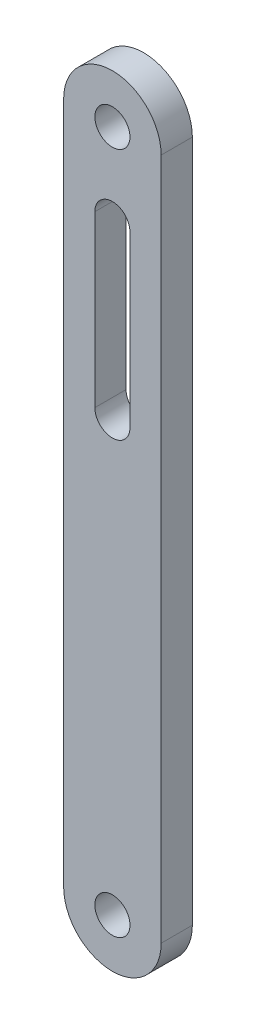
ISO-10303-21;
HEADER;
FILE_DESCRIPTION(('STEP AP214'),'2;1');
FILE_NAME('part.step','',(''),(''),'','','');
FILE_SCHEMA(('AUTOMOTIVE_DESIGN { 1 0 10303 214 1 1 1 1 }'));
ENDSEC;
DATA;
#1=APPLICATION_CONTEXT('core data for automotive mechanical design processes');
#2=APPLICATION_PROTOCOL_DEFINITION('international standard','automotive_design',2000,#1);
#3=PRODUCT_CONTEXT('',#1,'mechanical');
#4=PRODUCT('Part','Part','',(#3));
#5=PRODUCT_RELATED_PRODUCT_CATEGORY('part','',(#4));
#6=PRODUCT_DEFINITION_FORMATION('','',#4);
#7=PRODUCT_DEFINITION_CONTEXT('part definition',#1,'design');
#8=PRODUCT_DEFINITION('design','',#6,#7);
#9=PRODUCT_DEFINITION_SHAPE('','',#8);
#10=(LENGTH_UNIT() NAMED_UNIT(*) SI_UNIT(.MILLI.,.METRE.));
#11=(NAMED_UNIT(*) PLANE_ANGLE_UNIT() SI_UNIT($,.RADIAN.));
#12=(NAMED_UNIT(*) SI_UNIT($,.STERADIAN.) SOLID_ANGLE_UNIT());
#13=UNCERTAINTY_MEASURE_WITH_UNIT(LENGTH_MEASURE(1.E-05),#10,'distance_accuracy_value','');
#14=(GEOMETRIC_REPRESENTATION_CONTEXT(3) GLOBAL_UNCERTAINTY_ASSIGNED_CONTEXT((#13)) GLOBAL_UNIT_ASSIGNED_CONTEXT((#10,
#11,#12)) REPRESENTATION_CONTEXT('',''));
#15=CARTESIAN_POINT('',(0.,0.,0.));
#16=DIRECTION('',(0.,0.,1.));
#17=DIRECTION('',(1.,0.,0.));
#18=AXIS2_PLACEMENT_3D('',#15,#16,#17);
#19=CARTESIAN_POINT('',(0.,-35.,3.2));
#20=DIRECTION('',(0.,0.,1.));
#21=DIRECTION('',(1.,0.,0.));
#22=AXIS2_PLACEMENT_3D('',#19,#20,#21);
#23=PLANE('',#22);
#24=CARTESIAN_POINT('',(0.,35.,3.2));
#25=DIRECTION('',(0.,0.,1.));
#26=DIRECTION('',(1.,0.,0.));
#27=AXIS2_PLACEMENT_3D('',#24,#25,#26);
#28=CIRCLE('',#27,1.8);
#29=CARTESIAN_POINT('',(1.8,35.,3.2));
#30=VERTEX_POINT('',#29);
#31=EDGE_CURVE('E161',#30,#30,#28,.T.);
#32=ORIENTED_EDGE('',*,*,#31,.F.);
#33=EDGE_LOOP('',(#32));
#34=FACE_BOUND('',#33,.T.);
#35=CARTESIAN_POINT('',(0.,-35.,3.2));
#36=DIRECTION('',(0.,0.,1.));
#37=DIRECTION('',(1.,0.,0.));
#38=AXIS2_PLACEMENT_3D('',#35,#36,#37);
#39=CIRCLE('',#38,5.);
#40=CARTESIAN_POINT('',(-5.,-35.,3.2));
#41=VERTEX_POINT('',#40);
#42=CARTESIAN_POINT('',(5.,-35.,3.2));
#43=VERTEX_POINT('',#42);
#44=EDGE_CURVE('E169',#41,#43,#39,.T.);
#45=ORIENTED_EDGE('',*,*,#44,.T.);
#46=DIRECTION('',(0.,1.,0.));
#47=VECTOR('',#46,1.);
#48=CARTESIAN_POINT('',(5.,-35.,3.2));
#49=LINE('',#48,#47);
#50=CARTESIAN_POINT('',(5.,35.,3.2));
#51=VERTEX_POINT('',#50);
#52=EDGE_CURVE('E173',#43,#51,#49,.T.);
#53=ORIENTED_EDGE('',*,*,#52,.T.);
#54=CARTESIAN_POINT('',(0.,35.,3.2));
#55=DIRECTION('',(0.,0.,1.));
#56=DIRECTION('',(1.,0.,0.));
#57=AXIS2_PLACEMENT_3D('',#54,#55,#56);
#58=CIRCLE('',#57,5.);
#59=CARTESIAN_POINT('',(-5.00000000000001,35.,3.2));
#60=VERTEX_POINT('',#59);
#61=EDGE_CURVE('E177',#51,#60,#58,.T.);
#62=ORIENTED_EDGE('',*,*,#61,.T.);
#63=DIRECTION('',(0.,-1.,0.));
#64=VECTOR('',#63,1.);
#65=CARTESIAN_POINT('',(-5.,-35.,3.2));
#66=LINE('',#65,#64);
#67=EDGE_CURVE('E180',#60,#41,#66,.T.);
#68=ORIENTED_EDGE('',*,*,#67,.T.);
#69=EDGE_LOOP('',(#45,#53,#62,#68));
#70=FACE_BOUND('',#69,.T.);
#71=CARTESIAN_POINT('',(0.,-35.,3.2));
#72=DIRECTION('',(0.,0.,1.));
#73=DIRECTION('',(1.,0.,0.));
#74=AXIS2_PLACEMENT_3D('',#71,#72,#73);
#75=CIRCLE('',#74,1.8);
#76=CARTESIAN_POINT('',(1.80000000000002,-35.,3.2));
#77=VERTEX_POINT('',#76);
#78=EDGE_CURVE('E153',#77,#77,#75,.T.);
#79=ORIENTED_EDGE('',*,*,#78,.F.);
#80=EDGE_LOOP('',(#79));
#81=FACE_BOUND('',#80,.T.);
#82=DIRECTION('',(0.,-1.,0.));
#83=VECTOR('',#82,1.);
#84=CARTESIAN_POINT('',(-1.8,26.574427131159,3.2));
#85=LINE('',#84,#83);
#86=CARTESIAN_POINT('',(-1.8,26.574427131159,3.2));
#87=VERTEX_POINT('',#86);
#88=CARTESIAN_POINT('',(-1.8,9.17058453839254,3.2));
#89=VERTEX_POINT('',#88);
#90=EDGE_CURVE('E114',#87,#89,#85,.T.);
#91=ORIENTED_EDGE('',*,*,#90,.F.);
#92=CARTESIAN_POINT('',(0.,26.574427131159,3.2));
#93=DIRECTION('',(0.,0.,1.));
#94=DIRECTION('',(1.,0.,0.));
#95=AXIS2_PLACEMENT_3D('',#92,#93,#94);
#96=CIRCLE('',#95,1.8);
#97=CARTESIAN_POINT('',(1.8,26.574427131159,3.2));
#98=VERTEX_POINT('',#97);
#99=EDGE_CURVE('E105',#98,#87,#96,.T.);
#100=ORIENTED_EDGE('',*,*,#99,.F.);
#101=DIRECTION('',(0.,1.,0.));
#102=VECTOR('',#101,1.);
#103=CARTESIAN_POINT('',(1.8,26.574427131159,3.2));
#104=LINE('',#103,#102);
#105=CARTESIAN_POINT('',(1.8,9.17058453839255,3.2));
#106=VERTEX_POINT('',#105);
#107=EDGE_CURVE('E131',#106,#98,#104,.T.);
#108=ORIENTED_EDGE('',*,*,#107,.F.);
#109=CARTESIAN_POINT('',(0.,9.17058453839256,3.2));
#110=DIRECTION('',(0.,0.,1.));
#111=DIRECTION('',(1.,0.,0.));
#112=AXIS2_PLACEMENT_3D('',#109,#110,#111);
#113=CIRCLE('',#112,1.8);
#114=EDGE_CURVE('E127',#89,#106,#113,.T.);
#115=ORIENTED_EDGE('',*,*,#114,.F.);
#116=EDGE_LOOP('',(#91,#100,#108,#115));
#117=FACE_BOUND('',#116,.T.);
#118=ADVANCED_FACE('F39',(#34,#70,#81,#117),#23,.T.);
#119=CARTESIAN_POINT('',(0.,-35.,0.));
#120=DIRECTION('',(0.,0.,1.));
#121=DIRECTION('',(1.,0.,0.));
#122=AXIS2_PLACEMENT_3D('',#119,#120,#121);
#123=PLANE('',#122);
#124=CARTESIAN_POINT('',(0.,-35.,0.));
#125=DIRECTION('',(0.,0.,1.));
#126=DIRECTION('',(1.,0.,0.));
#127=AXIS2_PLACEMENT_3D('',#124,#125,#126);
#128=CIRCLE('',#127,1.8);
#129=CARTESIAN_POINT('',(1.80000000000002,-35.,0.));
#130=VERTEX_POINT('',#129);
#131=EDGE_CURVE('E123',#130,#130,#128,.T.);
#132=ORIENTED_EDGE('',*,*,#131,.T.);
#133=EDGE_LOOP('',(#132));
#134=FACE_BOUND('',#133,.T.);
#135=CARTESIAN_POINT('',(0.,35.,0.));
#136=DIRECTION('',(0.,0.,1.));
#137=DIRECTION('',(1.,0.,0.));
#138=AXIS2_PLACEMENT_3D('',#135,#136,#137);
#139=CIRCLE('',#138,1.8);
#140=CARTESIAN_POINT('',(1.8,35.,0.));
#141=VERTEX_POINT('',#140);
#142=EDGE_CURVE('E157',#141,#141,#139,.T.);
#143=ORIENTED_EDGE('',*,*,#142,.T.);
#144=EDGE_LOOP('',(#143));
#145=FACE_BOUND('',#144,.T.);
#146=CARTESIAN_POINT('',(0.,-35.,0.));
#147=DIRECTION('',(0.,0.,1.));
#148=DIRECTION('',(1.,0.,0.));
#149=AXIS2_PLACEMENT_3D('',#146,#147,#148);
#150=CIRCLE('',#149,5.);
#151=CARTESIAN_POINT('',(-5.,-35.,0.));
#152=VERTEX_POINT('',#151);
#153=CARTESIAN_POINT('',(5.,-35.,0.));
#154=VERTEX_POINT('',#153);
#155=EDGE_CURVE('E165',#152,#154,#150,.T.);
#156=ORIENTED_EDGE('',*,*,#155,.F.);
#157=DIRECTION('',(0.,-1.,0.));
#158=VECTOR('',#157,1.);
#159=CARTESIAN_POINT('',(-5.,-35.,0.));
#160=LINE('',#159,#158);
#161=CARTESIAN_POINT('',(-5.00000000000001,35.,0.));
#162=VERTEX_POINT('',#161);
#163=EDGE_CURVE('E174',#162,#152,#160,.T.);
#164=ORIENTED_EDGE('',*,*,#163,.F.);
#165=CARTESIAN_POINT('',(0.,35.,0.));
#166=DIRECTION('',(0.,0.,1.));
#167=DIRECTION('',(1.,0.,0.));
#168=AXIS2_PLACEMENT_3D('',#165,#166,#167);
#169=CIRCLE('',#168,5.);
#170=CARTESIAN_POINT('',(5.,35.,0.));
#171=VERTEX_POINT('',#170);
#172=EDGE_CURVE('E190',#171,#162,#169,.T.);
#173=ORIENTED_EDGE('',*,*,#172,.F.);
#174=DIRECTION('',(0.,1.,0.));
#175=VECTOR('',#174,1.);
#176=CARTESIAN_POINT('',(5.,-35.,0.));
#177=LINE('',#176,#175);
#178=EDGE_CURVE('E187',#154,#171,#177,.T.);
#179=ORIENTED_EDGE('',*,*,#178,.F.);
#180=EDGE_LOOP('',(#156,#164,#173,#179));
#181=FACE_BOUND('',#180,.T.);
#182=CARTESIAN_POINT('',(0.,26.574427131159,0.));
#183=DIRECTION('',(0.,0.,1.));
#184=DIRECTION('',(1.,0.,0.));
#185=AXIS2_PLACEMENT_3D('',#182,#183,#184);
#186=CIRCLE('',#185,1.8);
#187=CARTESIAN_POINT('',(1.8,26.574427131159,0.));
#188=VERTEX_POINT('',#187);
#189=CARTESIAN_POINT('',(-1.8,26.574427131159,0.));
#190=VERTEX_POINT('',#189);
#191=EDGE_CURVE('E63',#188,#190,#186,.T.);
#192=ORIENTED_EDGE('',*,*,#191,.T.);
#193=DIRECTION('',(0.,-1.,0.));
#194=VECTOR('',#193,1.);
#195=CARTESIAN_POINT('',(-1.8,26.574427131159,0.));
#196=LINE('',#195,#194);
#197=CARTESIAN_POINT('',(-1.8,9.17058453839254,0.));
#198=VERTEX_POINT('',#197);
#199=EDGE_CURVE('E121',#190,#198,#196,.T.);
#200=ORIENTED_EDGE('',*,*,#199,.T.);
#201=CARTESIAN_POINT('',(0.,9.17058453839256,0.));
#202=DIRECTION('',(0.,0.,1.));
#203=DIRECTION('',(1.,0.,0.));
#204=AXIS2_PLACEMENT_3D('',#201,#202,#203);
#205=CIRCLE('',#204,1.8);
#206=CARTESIAN_POINT('',(1.8,9.17058453839254,0.));
#207=VERTEX_POINT('',#206);
#208=EDGE_CURVE('E140',#198,#207,#205,.T.);
#209=ORIENTED_EDGE('',*,*,#208,.T.);
#210=DIRECTION('',(0.,1.,0.));
#211=VECTOR('',#210,1.);
#212=CARTESIAN_POINT('',(1.8,26.574427131159,0.));
#213=LINE('',#212,#211);
#214=EDGE_CURVE('E115',#207,#188,#213,.T.);
#215=ORIENTED_EDGE('',*,*,#214,.T.);
#216=EDGE_LOOP('',(#192,#200,#209,#215));
#217=FACE_BOUND('',#216,.T.);
#218=ADVANCED_FACE('F213',(#134,#145,#181,#217),#123,.F.);
#219=CARTESIAN_POINT('',(0.,-35.,3.2));
#220=DIRECTION('',(0.,0.,-1.));
#221=DIRECTION('',(-1.,0.,0.));
#222=AXIS2_PLACEMENT_3D('',#219,#220,#221);
#223=CYLINDRICAL_SURFACE('',#222,5.);
#224=ORIENTED_EDGE('',*,*,#155,.T.);
#225=DIRECTION('',(0.,0.,-1.));
#226=VECTOR('',#225,1.);
#227=CARTESIAN_POINT('',(5.,-35.,3.2));
#228=LINE('',#227,#226);
#229=EDGE_CURVE('E11',#43,#154,#228,.T.);
#230=ORIENTED_EDGE('',*,*,#229,.F.);
#231=ORIENTED_EDGE('',*,*,#44,.F.);
#232=DIRECTION('',(0.,0.,-1.));
#233=VECTOR('',#232,1.);
#234=CARTESIAN_POINT('',(-5.,-35.,3.2));
#235=LINE('',#234,#233);
#236=EDGE_CURVE('E183',#41,#152,#235,.T.);
#237=ORIENTED_EDGE('',*,*,#236,.T.);
#238=EDGE_LOOP('',(#224,#230,#231,#237));
#239=FACE_BOUND('',#238,.T.);
#240=ADVANCED_FACE('F41',(#239),#223,.T.);
#241=CARTESIAN_POINT('',(5.,-35.,3.2));
#242=DIRECTION('',(-1.,0.,0.));
#243=DIRECTION('',(0.,-1.,0.));
#244=AXIS2_PLACEMENT_3D('',#241,#242,#243);
#245=PLANE('',#244);
#246=ORIENTED_EDGE('',*,*,#178,.T.);
#247=DIRECTION('',(0.,0.,-1.));
#248=VECTOR('',#247,1.);
#249=CARTESIAN_POINT('',(5.,35.,3.2));
#250=LINE('',#249,#248);
#251=EDGE_CURVE('E48',#51,#171,#250,.T.);
#252=ORIENTED_EDGE('',*,*,#251,.F.);
#253=ORIENTED_EDGE('',*,*,#52,.F.);
#254=ORIENTED_EDGE('',*,*,#229,.T.);
#255=EDGE_LOOP('',(#246,#252,#253,#254));
#256=FACE_BOUND('',#255,.T.);
#257=ADVANCED_FACE('F224',(#256),#245,.F.);
#258=CARTESIAN_POINT('',(0.,35.,3.2));
#259=DIRECTION('',(0.,0.,-1.));
#260=DIRECTION('',(-1.,0.,0.));
#261=AXIS2_PLACEMENT_3D('',#258,#259,#260);
#262=CYLINDRICAL_SURFACE('',#261,5.);
#263=ORIENTED_EDGE('',*,*,#172,.T.);
#264=DIRECTION('',(0.,0.,-1.));
#265=VECTOR('',#264,1.);
#266=CARTESIAN_POINT('',(-5.00000000000001,35.,3.2));
#267=LINE('',#266,#265);
#268=EDGE_CURVE('E198',#60,#162,#267,.T.);
#269=ORIENTED_EDGE('',*,*,#268,.F.);
#270=ORIENTED_EDGE('',*,*,#61,.F.);
#271=ORIENTED_EDGE('',*,*,#251,.T.);
#272=EDGE_LOOP('',(#263,#269,#270,#271));
#273=FACE_BOUND('',#272,.T.);
#274=ADVANCED_FACE('F207',(#273),#262,.T.);
#275=CARTESIAN_POINT('',(-5.,-35.,3.2));
#276=DIRECTION('',(1.,0.,0.));
#277=DIRECTION('',(0.,1.,0.));
#278=AXIS2_PLACEMENT_3D('',#275,#276,#277);
#279=PLANE('',#278);
#280=ORIENTED_EDGE('',*,*,#163,.T.);
#281=ORIENTED_EDGE('',*,*,#236,.F.);
#282=ORIENTED_EDGE('',*,*,#67,.F.);
#283=ORIENTED_EDGE('',*,*,#268,.T.);
#284=EDGE_LOOP('',(#280,#281,#282,#283));
#285=FACE_BOUND('',#284,.T.);
#286=ADVANCED_FACE('F217',(#285),#279,.F.);
#287=CARTESIAN_POINT('',(0.,35.,3.2));
#288=DIRECTION('',(0.,0.,-1.));
#289=DIRECTION('',(-1.,0.,0.));
#290=AXIS2_PLACEMENT_3D('',#287,#288,#289);
#291=CYLINDRICAL_SURFACE('',#290,1.8);
#292=ORIENTED_EDGE('',*,*,#31,.T.);
#293=EDGE_LOOP('',(#292));
#294=FACE_BOUND('',#293,.T.);
#295=ORIENTED_EDGE('',*,*,#142,.F.);
#296=EDGE_LOOP('',(#295));
#297=FACE_BOUND('',#296,.T.);
#298=ADVANCED_FACE('F241',(#294,#297),#291,.F.);
#299=CARTESIAN_POINT('',(0.,-35.,3.2));
#300=DIRECTION('',(0.,0.,-1.));
#301=DIRECTION('',(-1.,0.,0.));
#302=AXIS2_PLACEMENT_3D('',#299,#300,#301);
#303=CYLINDRICAL_SURFACE('',#302,1.8);
#304=ORIENTED_EDGE('',*,*,#78,.T.);
#305=EDGE_LOOP('',(#304));
#306=FACE_BOUND('',#305,.T.);
#307=ORIENTED_EDGE('',*,*,#131,.F.);
#308=EDGE_LOOP('',(#307));
#309=FACE_BOUND('',#308,.T.);
#310=ADVANCED_FACE('F248',(#306,#309),#303,.F.);
#311=CARTESIAN_POINT('',(0.,26.574427131159,3.2));
#312=DIRECTION('',(0.,0.,-1.));
#313=DIRECTION('',(-1.,0.,0.));
#314=AXIS2_PLACEMENT_3D('',#311,#312,#313);
#315=CYLINDRICAL_SURFACE('',#314,1.8);
#316=ORIENTED_EDGE('',*,*,#191,.F.);
#317=DIRECTION('',(0.,0.,-1.));
#318=VECTOR('',#317,1.);
#319=CARTESIAN_POINT('',(1.8,26.574427131159,3.2));
#320=LINE('',#319,#318);
#321=EDGE_CURVE('E109',#98,#188,#320,.T.);
#322=ORIENTED_EDGE('',*,*,#321,.F.);
#323=ORIENTED_EDGE('',*,*,#99,.T.);
#324=DIRECTION('',(0.,0.,-1.));
#325=VECTOR('',#324,1.);
#326=CARTESIAN_POINT('',(-1.8,26.574427131159,3.2));
#327=LINE('',#326,#325);
#328=EDGE_CURVE('E108',#87,#190,#327,.T.);
#329=ORIENTED_EDGE('',*,*,#328,.T.);
#330=EDGE_LOOP('',(#316,#322,#323,#329));
#331=FACE_BOUND('',#330,.T.);
#332=ADVANCED_FACE('F107',(#331),#315,.F.);
#333=CARTESIAN_POINT('',(-1.8,26.574427131159,3.2));
#334=DIRECTION('',(1.,0.,0.));
#335=DIRECTION('',(0.,1.,0.));
#336=AXIS2_PLACEMENT_3D('',#333,#334,#335);
#337=PLANE('',#336);
#338=ORIENTED_EDGE('',*,*,#199,.F.);
#339=ORIENTED_EDGE('',*,*,#328,.F.);
#340=ORIENTED_EDGE('',*,*,#90,.T.);
#341=DIRECTION('',(0.,0.,-1.));
#342=VECTOR('',#341,1.);
#343=CARTESIAN_POINT('',(-1.8,9.17058453839254,3.2));
#344=LINE('',#343,#342);
#345=EDGE_CURVE('E124',#89,#198,#344,.T.);
#346=ORIENTED_EDGE('',*,*,#345,.T.);
#347=EDGE_LOOP('',(#338,#339,#340,#346));
#348=FACE_BOUND('',#347,.T.);
#349=ADVANCED_FACE('F118',(#348),#337,.T.);
#350=CARTESIAN_POINT('',(0.,9.17058453839256,3.2));
#351=DIRECTION('',(0.,0.,-1.));
#352=DIRECTION('',(-1.,0.,0.));
#353=AXIS2_PLACEMENT_3D('',#350,#351,#352);
#354=CYLINDRICAL_SURFACE('',#353,1.8);
#355=ORIENTED_EDGE('',*,*,#208,.F.);
#356=ORIENTED_EDGE('',*,*,#345,.F.);
#357=ORIENTED_EDGE('',*,*,#114,.T.);
#358=DIRECTION('',(0.,0.,-1.));
#359=VECTOR('',#358,1.);
#360=CARTESIAN_POINT('',(1.8,9.17058453839254,3.2));
#361=LINE('',#360,#359);
#362=EDGE_CURVE('E55',#106,#207,#361,.T.);
#363=ORIENTED_EDGE('',*,*,#362,.T.);
#364=EDGE_LOOP('',(#355,#356,#357,#363));
#365=FACE_BOUND('',#364,.T.);
#366=ADVANCED_FACE('F265',(#365),#354,.F.);
#367=CARTESIAN_POINT('',(1.8,26.574427131159,3.2));
#368=DIRECTION('',(-1.,0.,0.));
#369=DIRECTION('',(0.,0.,1.));
#370=AXIS2_PLACEMENT_3D('',#367,#368,#369);
#371=PLANE('',#370);
#372=ORIENTED_EDGE('',*,*,#214,.F.);
#373=ORIENTED_EDGE('',*,*,#362,.F.);
#374=ORIENTED_EDGE('',*,*,#107,.T.);
#375=ORIENTED_EDGE('',*,*,#321,.T.);
#376=EDGE_LOOP('',(#372,#373,#374,#375));
#377=FACE_BOUND('',#376,.T.);
#378=ADVANCED_FACE('F268',(#377),#371,.T.);
#379=CLOSED_SHELL('',(#118,#218,#240,#257,#274,#286,#298,#310,#332,#349,#366,#378));
#380=MANIFOLD_SOLID_BREP('B2',#379);
#381=ADVANCED_BREP_SHAPE_REPRESENTATION('',(#18,#380),#14);
#382=SHAPE_DEFINITION_REPRESENTATION(#9,#381);
ENDSEC;
END-ISO-10303-21;
